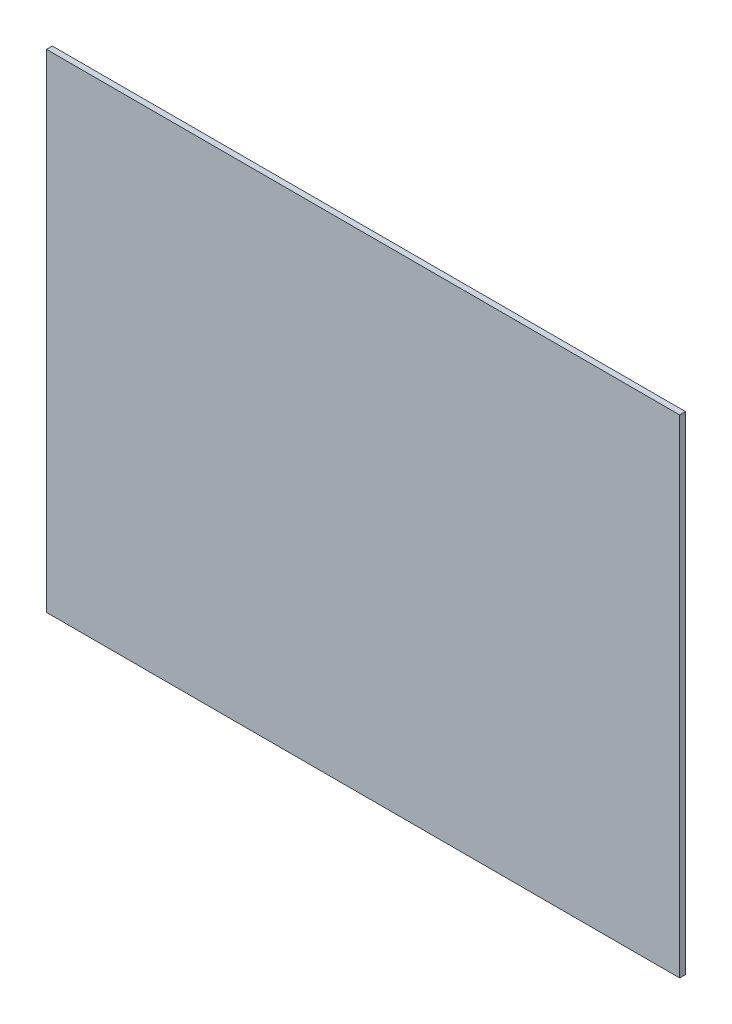
ISO-10303-21;
HEADER;
FILE_DESCRIPTION(('STEP AP214'),'2;1');
FILE_NAME('part.step','',(''),(''),'','','');
FILE_SCHEMA(('AUTOMOTIVE_DESIGN { 1 0 10303 214 1 1 1 1 }'));
ENDSEC;
DATA;
#1=APPLICATION_CONTEXT('core data for automotive mechanical design processes');
#2=APPLICATION_PROTOCOL_DEFINITION('international standard','automotive_design',2000,#1);
#3=PRODUCT_CONTEXT('',#1,'mechanical');
#4=PRODUCT('Part','Part','',(#3));
#5=PRODUCT_RELATED_PRODUCT_CATEGORY('part','',(#4));
#6=PRODUCT_DEFINITION_FORMATION('','',#4);
#7=PRODUCT_DEFINITION_CONTEXT('part definition',#1,'design');
#8=PRODUCT_DEFINITION('design','',#6,#7);
#9=PRODUCT_DEFINITION_SHAPE('','',#8);
#10=(LENGTH_UNIT() NAMED_UNIT(*) SI_UNIT(.MILLI.,.METRE.));
#11=(NAMED_UNIT(*) PLANE_ANGLE_UNIT() SI_UNIT($,.RADIAN.));
#12=(NAMED_UNIT(*) SI_UNIT($,.STERADIAN.) SOLID_ANGLE_UNIT());
#13=UNCERTAINTY_MEASURE_WITH_UNIT(LENGTH_MEASURE(1.E-05),#10,'distance_accuracy_value','');
#14=(GEOMETRIC_REPRESENTATION_CONTEXT(3) GLOBAL_UNCERTAINTY_ASSIGNED_CONTEXT((#13)) GLOBAL_UNIT_ASSIGNED_CONTEXT((#10,
#11,#12)) REPRESENTATION_CONTEXT('',''));
#15=CARTESIAN_POINT('',(0.,0.,0.));
#16=DIRECTION('',(0.,0.,1.));
#17=DIRECTION('',(1.,0.,0.));
#18=AXIS2_PLACEMENT_3D('',#15,#16,#17);
#19=CARTESIAN_POINT('',(217.5,167.5,4.));
#20=DIRECTION('',(-1.,0.,0.));
#21=DIRECTION('',(0.,0.,1.));
#22=AXIS2_PLACEMENT_3D('',#19,#20,#21);
#23=PLANE('',#22);
#24=DIRECTION('',(0.,1.,0.));
#25=VECTOR('',#24,1.);
#26=CARTESIAN_POINT('',(217.5,167.5,0.));
#27=LINE('',#26,#25);
#28=CARTESIAN_POINT('',(217.5,-167.5,0.));
#29=VERTEX_POINT('',#28);
#30=CARTESIAN_POINT('',(217.5,167.5,0.));
#31=VERTEX_POINT('',#30);
#32=EDGE_CURVE('E95',#29,#31,#27,.T.);
#33=ORIENTED_EDGE('',*,*,#32,.T.);
#34=DIRECTION('',(0.,0.,-1.));
#35=VECTOR('',#34,1.);
#36=CARTESIAN_POINT('',(217.5,167.5,4.));
#37=LINE('',#36,#35);
#38=CARTESIAN_POINT('',(217.5,167.5,4.));
#39=VERTEX_POINT('',#38);
#40=EDGE_CURVE('E11',#39,#31,#37,.T.);
#41=ORIENTED_EDGE('',*,*,#40,.F.);
#42=DIRECTION('',(0.,1.,0.));
#43=VECTOR('',#42,1.);
#44=CARTESIAN_POINT('',(217.5,167.5,4.));
#45=LINE('',#44,#43);
#46=CARTESIAN_POINT('',(217.5,-167.5,4.));
#47=VERTEX_POINT('',#46);
#48=EDGE_CURVE('E83',#47,#39,#45,.T.);
#49=ORIENTED_EDGE('',*,*,#48,.F.);
#50=DIRECTION('',(0.,0.,-1.));
#51=VECTOR('',#50,1.);
#52=CARTESIAN_POINT('',(217.5,-167.5,4.));
#53=LINE('',#52,#51);
#54=EDGE_CURVE('E91',#47,#29,#53,.T.);
#55=ORIENTED_EDGE('',*,*,#54,.T.);
#56=EDGE_LOOP('',(#33,#41,#49,#55));
#57=FACE_BOUND('',#56,.T.);
#58=ADVANCED_FACE('F32',(#57),#23,.F.);
#59=CARTESIAN_POINT('',(-217.5,167.5,4.));
#60=DIRECTION('',(0.,-1.,0.));
#61=DIRECTION('',(0.,0.,-1.));
#62=AXIS2_PLACEMENT_3D('',#59,#60,#61);
#63=PLANE('',#62);
#64=DIRECTION('',(-1.,0.,0.));
#65=VECTOR('',#64,1.);
#66=CARTESIAN_POINT('',(-217.5,167.5,0.));
#67=LINE('',#66,#65);
#68=CARTESIAN_POINT('',(-217.5,167.5,0.));
#69=VERTEX_POINT('',#68);
#70=EDGE_CURVE('E87',#31,#69,#67,.T.);
#71=ORIENTED_EDGE('',*,*,#70,.T.);
#72=DIRECTION('',(0.,0.,-1.));
#73=VECTOR('',#72,1.);
#74=CARTESIAN_POINT('',(-217.5,167.5,4.));
#75=LINE('',#74,#73);
#76=CARTESIAN_POINT('',(-217.5,167.5,4.));
#77=VERTEX_POINT('',#76);
#78=EDGE_CURVE('E40',#77,#69,#75,.T.);
#79=ORIENTED_EDGE('',*,*,#78,.F.);
#80=DIRECTION('',(-1.,0.,0.));
#81=VECTOR('',#80,1.);
#82=CARTESIAN_POINT('',(-217.5,167.5,4.));
#83=LINE('',#82,#81);
#84=EDGE_CURVE('E78',#39,#77,#83,.T.);
#85=ORIENTED_EDGE('',*,*,#84,.F.);
#86=ORIENTED_EDGE('',*,*,#40,.T.);
#87=EDGE_LOOP('',(#71,#79,#85,#86));
#88=FACE_BOUND('',#87,.T.);
#89=ADVANCED_FACE('F86',(#88),#63,.F.);
#90=CARTESIAN_POINT('',(-217.5,167.5,4.));
#91=DIRECTION('',(1.,0.,0.));
#92=DIRECTION('',(0.,0.,-1.));
#93=AXIS2_PLACEMENT_3D('',#90,#91,#92);
#94=PLANE('',#93);
#95=DIRECTION('',(0.,-1.,0.));
#96=VECTOR('',#95,1.);
#97=CARTESIAN_POINT('',(-217.5,167.5,0.));
#98=LINE('',#97,#96);
#99=CARTESIAN_POINT('',(-217.5,-167.5,0.));
#100=VERTEX_POINT('',#99);
#101=EDGE_CURVE('E65',#69,#100,#98,.T.);
#102=ORIENTED_EDGE('',*,*,#101,.T.);
#103=DIRECTION('',(0.,0.,-1.));
#104=VECTOR('',#103,1.);
#105=CARTESIAN_POINT('',(-217.5,-167.5,4.));
#106=LINE('',#105,#104);
#107=CARTESIAN_POINT('',(-217.5,-167.5,4.));
#108=VERTEX_POINT('',#107);
#109=EDGE_CURVE('E88',#108,#100,#106,.T.);
#110=ORIENTED_EDGE('',*,*,#109,.F.);
#111=DIRECTION('',(0.,-1.,0.));
#112=VECTOR('',#111,1.);
#113=CARTESIAN_POINT('',(-217.5,167.5,4.));
#114=LINE('',#113,#112);
#115=EDGE_CURVE('E81',#77,#108,#114,.T.);
#116=ORIENTED_EDGE('',*,*,#115,.F.);
#117=ORIENTED_EDGE('',*,*,#78,.T.);
#118=EDGE_LOOP('',(#102,#110,#116,#117));
#119=FACE_BOUND('',#118,.T.);
#120=ADVANCED_FACE('F89',(#119),#94,.F.);
#121=CARTESIAN_POINT('',(-217.5,-167.5,4.));
#122=DIRECTION('',(0.,1.,0.));
#123=DIRECTION('',(0.,0.,1.));
#124=AXIS2_PLACEMENT_3D('',#121,#122,#123);
#125=PLANE('',#124);
#126=DIRECTION('',(1.,0.,0.));
#127=VECTOR('',#126,1.);
#128=CARTESIAN_POINT('',(-217.5,-167.5,0.));
#129=LINE('',#128,#127);
#130=EDGE_CURVE('E71',#100,#29,#129,.T.);
#131=ORIENTED_EDGE('',*,*,#130,.T.);
#132=ORIENTED_EDGE('',*,*,#54,.F.);
#133=DIRECTION('',(1.,0.,0.));
#134=VECTOR('',#133,1.);
#135=CARTESIAN_POINT('',(-217.5,-167.5,4.));
#136=LINE('',#135,#134);
#137=EDGE_CURVE('E48',#108,#47,#136,.T.);
#138=ORIENTED_EDGE('',*,*,#137,.F.);
#139=ORIENTED_EDGE('',*,*,#109,.T.);
#140=EDGE_LOOP('',(#131,#132,#138,#139));
#141=FACE_BOUND('',#140,.T.);
#142=ADVANCED_FACE('F102',(#141),#125,.F.);
#143=CARTESIAN_POINT('',(0.,0.,4.));
#144=DIRECTION('',(0.,0.,1.));
#145=DIRECTION('',(1.,0.,0.));
#146=AXIS2_PLACEMENT_3D('',#143,#144,#145);
#147=PLANE('',#146);
#148=ORIENTED_EDGE('',*,*,#48,.T.);
#149=ORIENTED_EDGE('',*,*,#84,.T.);
#150=ORIENTED_EDGE('',*,*,#115,.T.);
#151=ORIENTED_EDGE('',*,*,#137,.T.);
#152=EDGE_LOOP('',(#148,#149,#150,#151));
#153=FACE_BOUND('',#152,.T.);
#154=ADVANCED_FACE('F79',(#153),#147,.T.);
#155=CARTESIAN_POINT('',(0.,0.,0.));
#156=DIRECTION('',(0.,0.,1.));
#157=DIRECTION('',(1.,0.,0.));
#158=AXIS2_PLACEMENT_3D('',#155,#156,#157);
#159=PLANE('',#158);
#160=ORIENTED_EDGE('',*,*,#32,.F.);
#161=ORIENTED_EDGE('',*,*,#130,.F.);
#162=ORIENTED_EDGE('',*,*,#101,.F.);
#163=ORIENTED_EDGE('',*,*,#70,.F.);
#164=EDGE_LOOP('',(#160,#161,#162,#163));
#165=FACE_BOUND('',#164,.T.);
#166=ADVANCED_FACE('F105',(#165),#159,.F.);
#167=CLOSED_SHELL('',(#58,#89,#120,#142,#154,#166));
#168=MANIFOLD_SOLID_BREP('B2',#167);
#169=ADVANCED_BREP_SHAPE_REPRESENTATION('',(#18,#168),#14);
#170=SHAPE_DEFINITION_REPRESENTATION(#9,#169);
ENDSEC;
END-ISO-10303-21;
